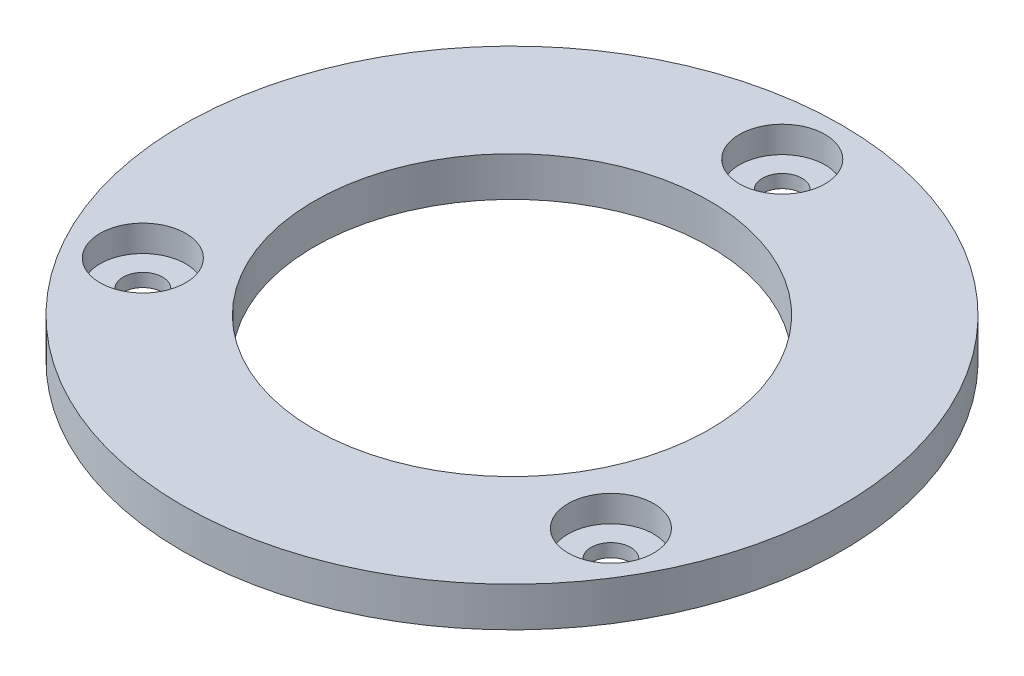
ISO-10303-21;
HEADER;
FILE_DESCRIPTION(('STEP AP214'),'2;1');
FILE_NAME('part.step','',(''),(''),'','','');
FILE_SCHEMA(('AUTOMOTIVE_DESIGN { 1 0 10303 214 1 1 1 1 }'));
ENDSEC;
DATA;
#1=APPLICATION_CONTEXT('core data for automotive mechanical design processes');
#2=APPLICATION_PROTOCOL_DEFINITION('international standard','automotive_design',2000,#1);
#3=PRODUCT_CONTEXT('',#1,'mechanical');
#4=PRODUCT('Part','Part','',(#3));
#5=PRODUCT_RELATED_PRODUCT_CATEGORY('part','',(#4));
#6=PRODUCT_DEFINITION_FORMATION('','',#4);
#7=PRODUCT_DEFINITION_CONTEXT('part definition',#1,'design');
#8=PRODUCT_DEFINITION('design','',#6,#7);
#9=PRODUCT_DEFINITION_SHAPE('','',#8);
#10=(LENGTH_UNIT() NAMED_UNIT(*) SI_UNIT(.MILLI.,.METRE.));
#11=(NAMED_UNIT(*) PLANE_ANGLE_UNIT() SI_UNIT($,.RADIAN.));
#12=(NAMED_UNIT(*) SI_UNIT($,.STERADIAN.) SOLID_ANGLE_UNIT());
#13=UNCERTAINTY_MEASURE_WITH_UNIT(LENGTH_MEASURE(1.E-05),#10,'distance_accuracy_value','');
#14=(GEOMETRIC_REPRESENTATION_CONTEXT(3) GLOBAL_UNCERTAINTY_ASSIGNED_CONTEXT((#13)) GLOBAL_UNIT_ASSIGNED_CONTEXT((#10,
#11,#12)) REPRESENTATION_CONTEXT('',''));
#15=CARTESIAN_POINT('',(0.,0.,0.));
#16=DIRECTION('',(0.,0.,1.));
#17=DIRECTION('',(1.,0.,0.));
#18=AXIS2_PLACEMENT_3D('',#15,#16,#17);
#19=CARTESIAN_POINT('',(0.,3.,-20.5));
#20=DIRECTION('',(0.,-1.,0.));
#21=DIRECTION('',(0.,0.,-1.));
#22=AXIS2_PLACEMENT_3D('',#19,#20,#21);
#23=CYLINDRICAL_SURFACE('',#22,1.5);
#24=CARTESIAN_POINT('',(0.,0.,-20.5));
#25=DIRECTION('',(0.,1.,0.));
#26=DIRECTION('',(0.,0.,1.));
#27=AXIS2_PLACEMENT_3D('',#24,#25,#26);
#28=CIRCLE('',#27,1.5);
#29=CARTESIAN_POINT('',(0.,0.,-19.));
#30=VERTEX_POINT('',#29);
#31=EDGE_CURVE('E51',#30,#30,#28,.T.);
#32=ORIENTED_EDGE('',*,*,#31,.F.);
#33=EDGE_LOOP('',(#32));
#34=FACE_BOUND('',#33,.T.);
#35=CARTESIAN_POINT('',(0.,1.,-20.5));
#36=DIRECTION('',(0.,1.,0.));
#37=DIRECTION('',(0.,0.,1.));
#38=AXIS2_PLACEMENT_3D('',#35,#36,#37);
#39=CIRCLE('',#38,1.5);
#40=CARTESIAN_POINT('',(0.,1.,-19.));
#41=VERTEX_POINT('',#40);
#42=EDGE_CURVE('E40',#41,#41,#39,.T.);
#43=ORIENTED_EDGE('',*,*,#42,.T.);
#44=EDGE_LOOP('',(#43));
#45=FACE_BOUND('',#44,.T.);
#46=ADVANCED_FACE('F36',(#34,#45),#23,.F.);
#47=CARTESIAN_POINT('',(17.753520777581,3.,10.25));
#48=DIRECTION('',(0.,-1.,0.));
#49=DIRECTION('',(0.,0.,-1.));
#50=AXIS2_PLACEMENT_3D('',#47,#48,#49);
#51=CYLINDRICAL_SURFACE('',#50,1.5);
#52=CARTESIAN_POINT('',(17.753520777581,0.,10.25));
#53=DIRECTION('',(0.,1.,0.));
#54=DIRECTION('',(0.,0.,1.));
#55=AXIS2_PLACEMENT_3D('',#52,#53,#54);
#56=CIRCLE('',#55,1.5);
#57=CARTESIAN_POINT('',(17.753520777581,0.,11.75));
#58=VERTEX_POINT('',#57);
#59=EDGE_CURVE('E84',#58,#58,#56,.T.);
#60=ORIENTED_EDGE('',*,*,#59,.F.);
#61=EDGE_LOOP('',(#60));
#62=FACE_BOUND('',#61,.T.);
#63=CARTESIAN_POINT('',(17.753520777581,1.,10.25));
#64=DIRECTION('',(0.,1.,0.));
#65=DIRECTION('',(0.,0.,1.));
#66=AXIS2_PLACEMENT_3D('',#63,#64,#65);
#67=CIRCLE('',#66,1.5);
#68=CARTESIAN_POINT('',(17.753520777581,1.,11.75));
#69=VERTEX_POINT('',#68);
#70=EDGE_CURVE('E59',#69,#69,#67,.T.);
#71=ORIENTED_EDGE('',*,*,#70,.T.);
#72=EDGE_LOOP('',(#71));
#73=FACE_BOUND('',#72,.T.);
#74=ADVANCED_FACE('F96',(#62,#73),#51,.F.);
#75=CARTESIAN_POINT('',(-17.753520777581,3.,10.25));
#76=DIRECTION('',(0.,-1.,0.));
#77=DIRECTION('',(0.,0.,-1.));
#78=AXIS2_PLACEMENT_3D('',#75,#76,#77);
#79=CYLINDRICAL_SURFACE('',#78,1.5);
#80=CARTESIAN_POINT('',(-17.753520777581,0.,10.25));
#81=DIRECTION('',(0.,1.,0.));
#82=DIRECTION('',(0.,0.,1.));
#83=AXIS2_PLACEMENT_3D('',#80,#81,#82);
#84=CIRCLE('',#83,1.5);
#85=CARTESIAN_POINT('',(-17.753520777581,0.,11.75));
#86=VERTEX_POINT('',#85);
#87=EDGE_CURVE('E78',#86,#86,#84,.T.);
#88=ORIENTED_EDGE('',*,*,#87,.F.);
#89=EDGE_LOOP('',(#88));
#90=FACE_BOUND('',#89,.T.);
#91=CARTESIAN_POINT('',(-17.753520777581,1.,10.25));
#92=DIRECTION('',(0.,1.,0.));
#93=DIRECTION('',(0.,0.,1.));
#94=AXIS2_PLACEMENT_3D('',#91,#92,#93);
#95=CIRCLE('',#94,1.5);
#96=CARTESIAN_POINT('',(-17.753520777581,1.,11.75));
#97=VERTEX_POINT('',#96);
#98=EDGE_CURVE('E56',#97,#97,#95,.T.);
#99=ORIENTED_EDGE('',*,*,#98,.T.);
#100=EDGE_LOOP('',(#99));
#101=FACE_BOUND('',#100,.T.);
#102=ADVANCED_FACE('F101',(#90,#101),#79,.F.);
#103=CARTESIAN_POINT('',(0.,3.,0.));
#104=DIRECTION('',(0.,1.,0.));
#105=DIRECTION('',(0.,0.,1.));
#106=AXIS2_PLACEMENT_3D('',#103,#104,#105);
#107=PLANE('',#106);
#108=CARTESIAN_POINT('',(0.,3.,-20.5));
#109=DIRECTION('',(0.,1.,0.));
#110=DIRECTION('',(0.,0.,1.));
#111=AXIS2_PLACEMENT_3D('',#108,#109,#110);
#112=CIRCLE('',#111,3.25);
#113=CARTESIAN_POINT('',(0.,3.,-17.25));
#114=VERTEX_POINT('',#113);
#115=EDGE_CURVE('E160',#114,#114,#112,.T.);
#116=ORIENTED_EDGE('',*,*,#115,.F.);
#117=EDGE_LOOP('',(#116));
#118=FACE_BOUND('',#117,.T.);
#119=CARTESIAN_POINT('',(17.753520777581,3.,10.25));
#120=DIRECTION('',(0.,1.,0.));
#121=DIRECTION('',(0.,0.,1.));
#122=AXIS2_PLACEMENT_3D('',#119,#120,#121);
#123=CIRCLE('',#122,3.25);
#124=CARTESIAN_POINT('',(17.753520777581,3.,13.5));
#125=VERTEX_POINT('',#124);
#126=EDGE_CURVE('E147',#125,#125,#123,.T.);
#127=ORIENTED_EDGE('',*,*,#126,.F.);
#128=EDGE_LOOP('',(#127));
#129=FACE_BOUND('',#128,.T.);
#130=CARTESIAN_POINT('',(-17.753520777581,3.,10.25));
#131=DIRECTION('',(0.,1.,0.));
#132=DIRECTION('',(0.,0.,1.));
#133=AXIS2_PLACEMENT_3D('',#130,#131,#132);
#134=CIRCLE('',#133,3.25);
#135=CARTESIAN_POINT('',(-17.753520777581,3.,13.5));
#136=VERTEX_POINT('',#135);
#137=EDGE_CURVE('E148',#136,#136,#134,.T.);
#138=ORIENTED_EDGE('',*,*,#137,.F.);
#139=EDGE_LOOP('',(#138));
#140=FACE_BOUND('',#139,.T.);
#141=CARTESIAN_POINT('',(0.,3.,0.));
#142=DIRECTION('',(0.,1.,0.));
#143=DIRECTION('',(0.,0.,1.));
#144=AXIS2_PLACEMENT_3D('',#141,#142,#143);
#145=CIRCLE('',#144,25.);
#146=CARTESIAN_POINT('',(0.,3.,25.));
#147=VERTEX_POINT('',#146);
#148=EDGE_CURVE('E10',#147,#147,#145,.T.);
#149=ORIENTED_EDGE('',*,*,#148,.T.);
#150=EDGE_LOOP('',(#149));
#151=FACE_BOUND('',#150,.T.);
#152=CARTESIAN_POINT('',(0.,3.,0.));
#153=DIRECTION('',(0.,1.,0.));
#154=DIRECTION('',(0.,0.,1.));
#155=AXIS2_PLACEMENT_3D('',#152,#153,#154);
#156=CIRCLE('',#155,15.);
#157=CARTESIAN_POINT('',(0.,3.,15.));
#158=VERTEX_POINT('',#157);
#159=EDGE_CURVE('E72',#158,#158,#156,.T.);
#160=ORIENTED_EDGE('',*,*,#159,.F.);
#161=EDGE_LOOP('',(#160));
#162=FACE_BOUND('',#161,.T.);
#163=ADVANCED_FACE('F106',(#118,#129,#140,#151,#162),#107,.T.);
#164=CARTESIAN_POINT('',(0.,0.,0.));
#165=DIRECTION('',(0.,1.,0.));
#166=DIRECTION('',(0.,0.,1.));
#167=AXIS2_PLACEMENT_3D('',#164,#165,#166);
#168=PLANE('',#167);
#169=CARTESIAN_POINT('',(0.,0.,0.));
#170=DIRECTION('',(0.,1.,0.));
#171=DIRECTION('',(0.,0.,1.));
#172=AXIS2_PLACEMENT_3D('',#169,#170,#171);
#173=CIRCLE('',#172,25.);
#174=CARTESIAN_POINT('',(0.,0.,25.));
#175=VERTEX_POINT('',#174);
#176=EDGE_CURVE('E45',#175,#175,#173,.T.);
#177=ORIENTED_EDGE('',*,*,#176,.F.);
#178=EDGE_LOOP('',(#177));
#179=FACE_BOUND('',#178,.T.);
#180=ORIENTED_EDGE('',*,*,#31,.T.);
#181=EDGE_LOOP('',(#180));
#182=FACE_BOUND('',#181,.T.);
#183=ORIENTED_EDGE('',*,*,#59,.T.);
#184=EDGE_LOOP('',(#183));
#185=FACE_BOUND('',#184,.T.);
#186=ORIENTED_EDGE('',*,*,#87,.T.);
#187=EDGE_LOOP('',(#186));
#188=FACE_BOUND('',#187,.T.);
#189=CARTESIAN_POINT('',(0.,0.,0.));
#190=DIRECTION('',(0.,1.,0.));
#191=DIRECTION('',(0.,0.,1.));
#192=AXIS2_PLACEMENT_3D('',#189,#190,#191);
#193=CIRCLE('',#192,15.);
#194=CARTESIAN_POINT('',(0.,0.,15.));
#195=VERTEX_POINT('',#194);
#196=EDGE_CURVE('E67',#195,#195,#193,.T.);
#197=ORIENTED_EDGE('',*,*,#196,.T.);
#198=EDGE_LOOP('',(#197));
#199=FACE_BOUND('',#198,.T.);
#200=ADVANCED_FACE('F93',(#179,#182,#185,#188,#199),#168,.F.);
#201=CARTESIAN_POINT('',(0.,3.,0.));
#202=DIRECTION('',(0.,-1.,0.));
#203=DIRECTION('',(0.,0.,-1.));
#204=AXIS2_PLACEMENT_3D('',#201,#202,#203);
#205=CYLINDRICAL_SURFACE('',#204,25.);
#206=ORIENTED_EDGE('',*,*,#148,.F.);
#207=EDGE_LOOP('',(#206));
#208=FACE_BOUND('',#207,.T.);
#209=ORIENTED_EDGE('',*,*,#176,.T.);
#210=EDGE_LOOP('',(#209));
#211=FACE_BOUND('',#210,.T.);
#212=ADVANCED_FACE('F38',(#208,#211),#205,.T.);
#213=CARTESIAN_POINT('',(0.,3.,0.));
#214=DIRECTION('',(0.,-1.,0.));
#215=DIRECTION('',(0.,0.,-1.));
#216=AXIS2_PLACEMENT_3D('',#213,#214,#215);
#217=CYLINDRICAL_SURFACE('',#216,15.);
#218=ORIENTED_EDGE('',*,*,#159,.T.);
#219=EDGE_LOOP('',(#218));
#220=FACE_BOUND('',#219,.T.);
#221=ORIENTED_EDGE('',*,*,#196,.F.);
#222=EDGE_LOOP('',(#221));
#223=FACE_BOUND('',#222,.T.);
#224=ADVANCED_FACE('F114',(#220,#223),#217,.F.);
#225=CARTESIAN_POINT('',(-17.753520777581,1.,10.25));
#226=DIRECTION('',(0.,1.,0.));
#227=DIRECTION('',(0.,0.,1.));
#228=AXIS2_PLACEMENT_3D('',#225,#226,#227);
#229=CYLINDRICAL_SURFACE('',#228,3.25);
#230=CARTESIAN_POINT('',(-17.753520777581,1.,10.25));
#231=DIRECTION('',(0.,1.,0.));
#232=DIRECTION('',(0.,0.,1.));
#233=AXIS2_PLACEMENT_3D('',#230,#231,#232);
#234=CIRCLE('',#233,3.25);
#235=CARTESIAN_POINT('',(-17.753520777581,1.,13.5));
#236=VERTEX_POINT('',#235);
#237=EDGE_CURVE('E145',#236,#236,#234,.T.);
#238=ORIENTED_EDGE('',*,*,#237,.F.);
#239=EDGE_LOOP('',(#238));
#240=FACE_BOUND('',#239,.T.);
#241=ORIENTED_EDGE('',*,*,#137,.T.);
#242=EDGE_LOOP('',(#241));
#243=FACE_BOUND('',#242,.T.);
#244=ADVANCED_FACE('F121',(#240,#243),#229,.F.);
#245=CARTESIAN_POINT('',(-17.753520777581,1.,10.25));
#246=DIRECTION('',(0.,1.,0.));
#247=DIRECTION('',(0.,0.,1.));
#248=AXIS2_PLACEMENT_3D('',#245,#246,#247);
#249=PLANE('',#248);
#250=ORIENTED_EDGE('',*,*,#98,.F.);
#251=EDGE_LOOP('',(#250));
#252=FACE_BOUND('',#251,.T.);
#253=ORIENTED_EDGE('',*,*,#237,.T.);
#254=EDGE_LOOP('',(#253));
#255=FACE_BOUND('',#254,.T.);
#256=ADVANCED_FACE('F127',(#252,#255),#249,.T.);
#257=CARTESIAN_POINT('',(17.753520777581,1.,10.25));
#258=DIRECTION('',(0.,1.,0.));
#259=DIRECTION('',(0.,0.,1.));
#260=AXIS2_PLACEMENT_3D('',#257,#258,#259);
#261=CYLINDRICAL_SURFACE('',#260,3.25);
#262=CARTESIAN_POINT('',(17.753520777581,1.,10.25));
#263=DIRECTION('',(0.,1.,0.));
#264=DIRECTION('',(0.,0.,1.));
#265=AXIS2_PLACEMENT_3D('',#262,#263,#264);
#266=CIRCLE('',#265,3.25);
#267=CARTESIAN_POINT('',(17.753520777581,1.,13.5));
#268=VERTEX_POINT('',#267);
#269=EDGE_CURVE('E153',#268,#268,#266,.T.);
#270=ORIENTED_EDGE('',*,*,#269,.F.);
#271=EDGE_LOOP('',(#270));
#272=FACE_BOUND('',#271,.T.);
#273=ORIENTED_EDGE('',*,*,#126,.T.);
#274=EDGE_LOOP('',(#273));
#275=FACE_BOUND('',#274,.T.);
#276=ADVANCED_FACE('F142',(#272,#275),#261,.F.);
#277=CARTESIAN_POINT('',(17.753520777581,1.,10.25));
#278=DIRECTION('',(0.,1.,0.));
#279=DIRECTION('',(0.,0.,1.));
#280=AXIS2_PLACEMENT_3D('',#277,#278,#279);
#281=PLANE('',#280);
#282=ORIENTED_EDGE('',*,*,#70,.F.);
#283=EDGE_LOOP('',(#282));
#284=FACE_BOUND('',#283,.T.);
#285=ORIENTED_EDGE('',*,*,#269,.T.);
#286=EDGE_LOOP('',(#285));
#287=FACE_BOUND('',#286,.T.);
#288=ADVANCED_FACE('F173',(#284,#287),#281,.T.);
#289=CARTESIAN_POINT('',(0.,1.,-20.5));
#290=DIRECTION('',(0.,1.,0.));
#291=DIRECTION('',(0.,0.,1.));
#292=AXIS2_PLACEMENT_3D('',#289,#290,#291);
#293=CYLINDRICAL_SURFACE('',#292,3.25);
#294=CARTESIAN_POINT('',(0.,1.,-20.5));
#295=DIRECTION('',(0.,1.,0.));
#296=DIRECTION('',(0.,0.,1.));
#297=AXIS2_PLACEMENT_3D('',#294,#295,#296);
#298=CIRCLE('',#297,3.25);
#299=CARTESIAN_POINT('',(0.,1.,-17.25));
#300=VERTEX_POINT('',#299);
#301=EDGE_CURVE('E60',#300,#300,#298,.T.);
#302=ORIENTED_EDGE('',*,*,#301,.F.);
#303=EDGE_LOOP('',(#302));
#304=FACE_BOUND('',#303,.T.);
#305=ORIENTED_EDGE('',*,*,#115,.T.);
#306=EDGE_LOOP('',(#305));
#307=FACE_BOUND('',#306,.T.);
#308=ADVANCED_FACE('F170',(#304,#307),#293,.F.);
#309=CARTESIAN_POINT('',(0.,1.,-20.5));
#310=DIRECTION('',(0.,1.,0.));
#311=DIRECTION('',(0.,0.,1.));
#312=AXIS2_PLACEMENT_3D('',#309,#310,#311);
#313=PLANE('',#312);
#314=ORIENTED_EDGE('',*,*,#42,.F.);
#315=EDGE_LOOP('',(#314));
#316=FACE_BOUND('',#315,.T.);
#317=ORIENTED_EDGE('',*,*,#301,.T.);
#318=EDGE_LOOP('',(#317));
#319=FACE_BOUND('',#318,.T.);
#320=ADVANCED_FACE('F168',(#316,#319),#313,.T.);
#321=CLOSED_SHELL('',(#46,#74,#102,#163,#200,#212,#224,#244,#256,#276,#288,#308,#320));
#322=MANIFOLD_SOLID_BREP('B2',#321);
#323=ADVANCED_BREP_SHAPE_REPRESENTATION('',(#18,#322),#14);
#324=SHAPE_DEFINITION_REPRESENTATION(#9,#323);
ENDSEC;
END-ISO-10303-21;
